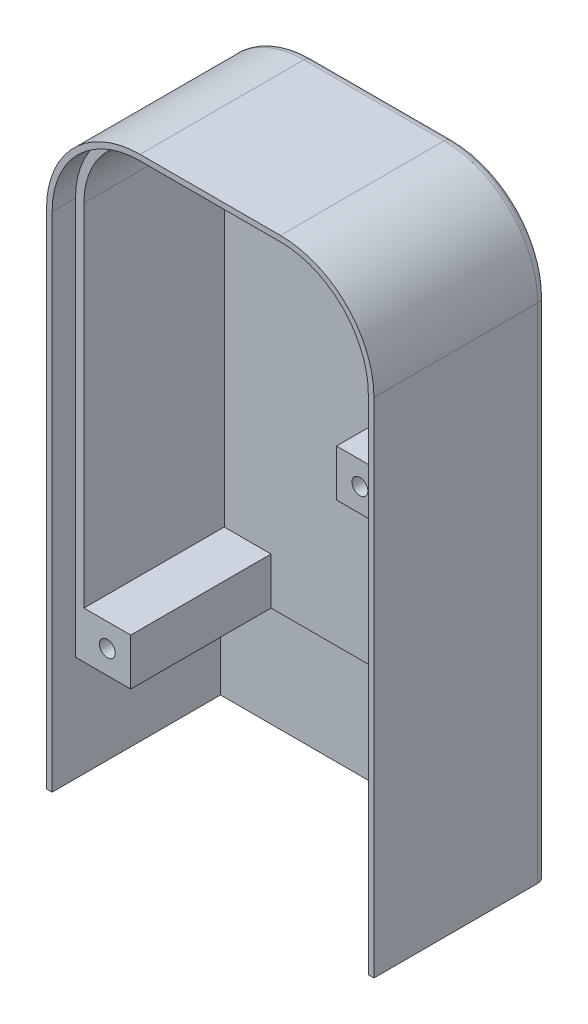
ISO-10303-21;
HEADER;
FILE_DESCRIPTION(('STEP AP214'),'2;1');
FILE_NAME('part.step','',(''),(''),'','','');
FILE_SCHEMA(('AUTOMOTIVE_DESIGN { 1 0 10303 214 1 1 1 1 }'));
ENDSEC;
DATA;
#1=APPLICATION_CONTEXT('core data for automotive mechanical design processes');
#2=APPLICATION_PROTOCOL_DEFINITION('international standard','automotive_design',2000,#1);
#3=PRODUCT_CONTEXT('',#1,'mechanical');
#4=PRODUCT('Part','Part','',(#3));
#5=PRODUCT_RELATED_PRODUCT_CATEGORY('part','',(#4));
#6=PRODUCT_DEFINITION_FORMATION('','',#4);
#7=PRODUCT_DEFINITION_CONTEXT('part definition',#1,'design');
#8=PRODUCT_DEFINITION('design','',#6,#7);
#9=PRODUCT_DEFINITION_SHAPE('','',#8);
#10=(LENGTH_UNIT() NAMED_UNIT(*) SI_UNIT(.MILLI.,.METRE.));
#11=(NAMED_UNIT(*) PLANE_ANGLE_UNIT() SI_UNIT($,.RADIAN.));
#12=(NAMED_UNIT(*) SI_UNIT($,.STERADIAN.) SOLID_ANGLE_UNIT());
#13=UNCERTAINTY_MEASURE_WITH_UNIT(LENGTH_MEASURE(1.E-05),#10,'distance_accuracy_value','');
#14=(GEOMETRIC_REPRESENTATION_CONTEXT(3) GLOBAL_UNCERTAINTY_ASSIGNED_CONTEXT((#13)) GLOBAL_UNIT_ASSIGNED_CONTEXT((#10,
#11,#12)) REPRESENTATION_CONTEXT('',''));
#15=CARTESIAN_POINT('',(0.,0.,0.));
#16=DIRECTION('',(0.,0.,1.));
#17=DIRECTION('',(1.,0.,0.));
#18=AXIS2_PLACEMENT_3D('',#15,#16,#17);
#19=CARTESIAN_POINT('',(0.,86.8176900029544,0.));
#20=DIRECTION('',(0.,1.,0.));
#21=DIRECTION('',(0.,0.,1.));
#22=AXIS2_PLACEMENT_3D('',#19,#20,#21);
#23=PLANE('',#22);
#24=CARTESIAN_POINT('',(187.366428173932,86.8176900029544,-35.));
#25=DIRECTION('',(0.,1.,0.));
#26=DIRECTION('',(0.,0.,1.));
#27=AXIS2_PLACEMENT_3D('',#24,#25,#26);
#28=CIRCLE('',#27,2.);
#29=CARTESIAN_POINT('',(187.366428173932,86.8176900029544,-37.));
#30=VERTEX_POINT('',#29);
#31=CARTESIAN_POINT('',(189.366428173932,86.8176900029544,-35.));
#32=VERTEX_POINT('',#31);
#33=EDGE_CURVE('E41',#30,#32,#28,.F.);
#34=ORIENTED_EDGE('',*,*,#33,.T.);
#35=DIRECTION('',(0.,0.,1.));
#36=VECTOR('',#35,1.);
#37=CARTESIAN_POINT('',(189.366428173932,86.8176900029544,-37.));
#38=LINE('',#37,#36);
#39=CARTESIAN_POINT('',(189.366428173932,86.8176900029544,0.));
#40=VERTEX_POINT('',#39);
#41=EDGE_CURVE('E467',#32,#40,#38,.T.);
#42=ORIENTED_EDGE('',*,*,#41,.T.);
#43=DIRECTION('',(-1.,0.,0.));
#44=VECTOR('',#43,1.);
#45=CARTESIAN_POINT('',(169.366428173932,86.8176900029544,0.));
#46=LINE('',#45,#44);
#47=CARTESIAN_POINT('',(188.166428173932,86.8176900029544,0.));
#48=VERTEX_POINT('',#47);
#49=EDGE_CURVE('E466',#40,#48,#46,.T.);
#50=ORIENTED_EDGE('',*,*,#49,.T.);
#51=DIRECTION('',(0.,0.,1.));
#52=VECTOR('',#51,1.);
#53=CARTESIAN_POINT('',(188.166428173932,86.8176900029544,-37.));
#54=LINE('',#53,#52);
#55=CARTESIAN_POINT('',(188.166428173932,86.8176900029544,-36.));
#56=VERTEX_POINT('',#55);
#57=EDGE_CURVE('E449',#56,#48,#54,.T.);
#58=ORIENTED_EDGE('',*,*,#57,.F.);
#59=DIRECTION('',(-1.,0.,0.));
#60=VECTOR('',#59,1.);
#61=CARTESIAN_POINT('',(120.566428173932,86.8176900029544,-36.));
#62=LINE('',#61,#60);
#63=CARTESIAN_POINT('',(120.566428173932,86.8176900029544,-36.));
#64=VERTEX_POINT('',#63);
#65=EDGE_CURVE('E11',#56,#64,#62,.T.);
#66=ORIENTED_EDGE('',*,*,#65,.T.);
#67=DIRECTION('',(0.,0.,-1.));
#68=VECTOR('',#67,1.);
#69=CARTESIAN_POINT('',(120.566428173932,86.8176900029544,-37.));
#70=LINE('',#69,#68);
#71=CARTESIAN_POINT('',(120.566428173932,86.8176900029544,0.));
#72=VERTEX_POINT('',#71);
#73=EDGE_CURVE('E49',#72,#64,#70,.T.);
#74=ORIENTED_EDGE('',*,*,#73,.F.);
#75=CARTESIAN_POINT('',(119.366428173932,86.8176900029544,0.));
#76=VERTEX_POINT('',#75);
#77=EDGE_CURVE('E462',#72,#76,#46,.T.);
#78=ORIENTED_EDGE('',*,*,#77,.T.);
#79=DIRECTION('',(0.,0.,-1.));
#80=VECTOR('',#79,1.);
#81=CARTESIAN_POINT('',(119.366428173932,86.8176900029544,-37.));
#82=LINE('',#81,#80);
#83=CARTESIAN_POINT('',(119.366428173932,86.8176900029544,-35.));
#84=VERTEX_POINT('',#83);
#85=EDGE_CURVE('E470',#76,#84,#82,.T.);
#86=ORIENTED_EDGE('',*,*,#85,.T.);
#87=CARTESIAN_POINT('',(121.366428173932,86.8176900029544,-35.));
#88=DIRECTION('',(0.,1.,0.));
#89=DIRECTION('',(0.,0.,1.));
#90=AXIS2_PLACEMENT_3D('',#87,#88,#89);
#91=CIRCLE('',#90,2.);
#92=CARTESIAN_POINT('',(121.366428173932,86.8176900029544,-37.));
#93=VERTEX_POINT('',#92);
#94=EDGE_CURVE('E465',#84,#93,#91,.F.);
#95=ORIENTED_EDGE('',*,*,#94,.T.);
#96=DIRECTION('',(-1.,0.,0.));
#97=VECTOR('',#96,1.);
#98=CARTESIAN_POINT('',(169.366428173932,86.8176900029544,-37.));
#99=LINE('',#98,#97);
#100=EDGE_CURVE('E36',#30,#93,#99,.T.);
#101=ORIENTED_EDGE('',*,*,#100,.F.);
#102=EDGE_LOOP('',(#34,#42,#50,#58,#66,#74,#78,#86,#95,#101));
#103=FACE_BOUND('',#102,.T.);
#104=ADVANCED_FACE('F33',(#103),#23,.F.);
#105=CARTESIAN_POINT('',(181.366428173932,171.317690002954,-25.));
#106=DIRECTION('',(0.,0.,-1.));
#107=DIRECTION('',(-1.,0.,0.));
#108=AXIS2_PLACEMENT_3D('',#105,#106,#107);
#109=PLANE('',#108);
#110=CARTESIAN_POINT('',(181.366428173932,171.317690002954,-25.));
#111=DIRECTION('',(0.,0.,-1.));
#112=DIRECTION('',(-1.,0.,0.));
#113=AXIS2_PLACEMENT_3D('',#110,#111,#112);
#114=CIRCLE('',#113,2.99999999999999);
#115=CARTESIAN_POINT('',(178.366428173932,171.317690002954,-25.));
#116=VERTEX_POINT('',#115);
#117=EDGE_CURVE('E263',#116,#116,#114,.T.);
#118=ORIENTED_EDGE('',*,*,#117,.T.);
#119=EDGE_LOOP('',(#118));
#120=FACE_BOUND('',#119,.T.);
#121=CARTESIAN_POINT('',(181.366428173932,171.317690002954,-25.));
#122=DIRECTION('',(0.,0.,-1.));
#123=DIRECTION('',(-1.,0.,0.));
#124=AXIS2_PLACEMENT_3D('',#121,#122,#123);
#125=CIRCLE('',#124,1.69999999999998);
#126=CARTESIAN_POINT('',(179.666428173932,171.317690002954,-25.));
#127=VERTEX_POINT('',#126);
#128=EDGE_CURVE('E266',#127,#127,#125,.F.);
#129=ORIENTED_EDGE('',*,*,#128,.T.);
#130=EDGE_LOOP('',(#129));
#131=FACE_BOUND('',#130,.T.);
#132=ADVANCED_FACE('F599',(#120,#131),#109,.T.);
#133=CARTESIAN_POINT('',(127.366428173932,114.317690002954,-25.));
#134=DIRECTION('',(0.,0.,-1.));
#135=DIRECTION('',(-1.,0.,0.));
#136=AXIS2_PLACEMENT_3D('',#133,#134,#135);
#137=PLANE('',#136);
#138=CARTESIAN_POINT('',(127.366428173932,114.317690002954,-25.));
#139=DIRECTION('',(0.,0.,-1.));
#140=DIRECTION('',(-1.,0.,0.));
#141=AXIS2_PLACEMENT_3D('',#138,#139,#140);
#142=CIRCLE('',#141,3.00000000000001);
#143=CARTESIAN_POINT('',(124.366428173932,114.317690002954,-25.));
#144=VERTEX_POINT('',#143);
#145=EDGE_CURVE('E255',#144,#144,#142,.T.);
#146=ORIENTED_EDGE('',*,*,#145,.T.);
#147=EDGE_LOOP('',(#146));
#148=FACE_BOUND('',#147,.T.);
#149=CARTESIAN_POINT('',(127.366428173932,114.317690002954,-25.));
#150=DIRECTION('',(0.,0.,-1.));
#151=DIRECTION('',(-1.,0.,0.));
#152=AXIS2_PLACEMENT_3D('',#149,#150,#151);
#153=CIRCLE('',#152,1.69999999999998);
#154=CARTESIAN_POINT('',(125.666428173932,114.317690002954,-25.));
#155=VERTEX_POINT('',#154);
#156=EDGE_CURVE('E258',#155,#155,#153,.F.);
#157=ORIENTED_EDGE('',*,*,#156,.T.);
#158=EDGE_LOOP('',(#157));
#159=FACE_BOUND('',#158,.T.);
#160=ADVANCED_FACE('F603',(#148,#159),#137,.T.);
#161=CARTESIAN_POINT('',(127.366428173932,114.317690002954,-4.50000000000011));
#162=DIRECTION('',(0.,0.,1.));
#163=DIRECTION('',(1.,0.,0.));
#164=AXIS2_PLACEMENT_3D('',#161,#162,#163);
#165=CYLINDRICAL_SURFACE('',#164,1.69999999999998);
#166=CARTESIAN_POINT('',(127.366428173932,114.317690002954,-5.));
#167=DIRECTION('',(0.,0.,1.));
#168=DIRECTION('',(1.,0.,0.));
#169=AXIS2_PLACEMENT_3D('',#166,#167,#168);
#170=CIRCLE('',#169,1.69999999999998);
#171=CARTESIAN_POINT('',(129.066428173932,114.317690002954,-5.));
#172=VERTEX_POINT('',#171);
#173=EDGE_CURVE('E421',#172,#172,#170,.T.);
#174=ORIENTED_EDGE('',*,*,#173,.T.);
#175=EDGE_LOOP('',(#174));
#176=FACE_BOUND('',#175,.T.);
#177=ORIENTED_EDGE('',*,*,#156,.F.);
#178=EDGE_LOOP('',(#177));
#179=FACE_BOUND('',#178,.T.);
#180=ADVANCED_FACE('F615',(#176,#179),#165,.F.);
#181=CARTESIAN_POINT('',(181.366428173932,171.317690002954,-4.50000000000011));
#182=DIRECTION('',(0.,0.,1.));
#183=DIRECTION('',(1.,0.,0.));
#184=AXIS2_PLACEMENT_3D('',#181,#182,#183);
#185=CYLINDRICAL_SURFACE('',#184,1.69999999999998);
#186=CARTESIAN_POINT('',(181.366428173932,171.317690002954,-5.));
#187=DIRECTION('',(0.,0.,1.));
#188=DIRECTION('',(1.,0.,0.));
#189=AXIS2_PLACEMENT_3D('',#186,#187,#188);
#190=CIRCLE('',#189,1.69999999999998);
#191=CARTESIAN_POINT('',(183.066428173932,171.317690002954,-5.));
#192=VERTEX_POINT('',#191);
#193=EDGE_CURVE('E297',#192,#192,#190,.T.);
#194=ORIENTED_EDGE('',*,*,#193,.T.);
#195=EDGE_LOOP('',(#194));
#196=FACE_BOUND('',#195,.T.);
#197=ORIENTED_EDGE('',*,*,#128,.F.);
#198=EDGE_LOOP('',(#197));
#199=FACE_BOUND('',#198,.T.);
#200=ADVANCED_FACE('F627',(#196,#199),#185,.F.);
#201=CARTESIAN_POINT('',(186.366428173932,166.317690002954,9.14213562373104));
#202=DIRECTION('',(0.,1.,0.));
#203=DIRECTION('',(0.,0.,1.));
#204=AXIS2_PLACEMENT_3D('',#201,#202,#203);
#205=PLANE('',#204);
#206=DIRECTION('',(1.,0.,0.));
#207=VECTOR('',#206,1.);
#208=CARTESIAN_POINT('',(186.366428173932,166.317690002954,-5.));
#209=LINE('',#208,#207);
#210=CARTESIAN_POINT('',(176.366428173932,166.317690002954,-5.));
#211=VERTEX_POINT('',#210);
#212=CARTESIAN_POINT('',(186.366428173932,166.317690002954,-5.));
#213=VERTEX_POINT('',#212);
#214=EDGE_CURVE('E284',#211,#213,#209,.T.);
#215=ORIENTED_EDGE('',*,*,#214,.F.);
#216=DIRECTION('',(0.,0.,-1.));
#217=VECTOR('',#216,1.);
#218=CARTESIAN_POINT('',(176.366428173932,166.317690002954,9.14213562373104));
#219=LINE('',#218,#217);
#220=CARTESIAN_POINT('',(176.366428173932,166.317690002954,-35.));
#221=VERTEX_POINT('',#220);
#222=EDGE_CURVE('E279',#211,#221,#219,.T.);
#223=ORIENTED_EDGE('',*,*,#222,.T.);
#224=DIRECTION('',(1.,0.,0.));
#225=VECTOR('',#224,1.);
#226=CARTESIAN_POINT('',(186.366428173932,166.317690002954,-35.));
#227=LINE('',#226,#225);
#228=CARTESIAN_POINT('',(186.366428173932,166.317690002954,-35.));
#229=VERTEX_POINT('',#228);
#230=EDGE_CURVE('E275',#221,#229,#227,.T.);
#231=ORIENTED_EDGE('',*,*,#230,.T.);
#232=DIRECTION('',(0.,0.,-1.));
#233=VECTOR('',#232,1.);
#234=CARTESIAN_POINT('',(186.366428173932,166.317690002954,9.14213562373104));
#235=LINE('',#234,#233);
#236=EDGE_CURVE('E278',#213,#229,#235,.T.);
#237=ORIENTED_EDGE('',*,*,#236,.F.);
#238=EDGE_LOOP('',(#215,#223,#231,#237));
#239=FACE_BOUND('',#238,.T.);
#240=ADVANCED_FACE('F535',(#239),#205,.F.);
#241=CARTESIAN_POINT('',(176.366428173932,166.317690002954,9.14213562373104));
#242=DIRECTION('',(1.,0.,0.));
#243=DIRECTION('',(0.,1.,0.));
#244=AXIS2_PLACEMENT_3D('',#241,#242,#243);
#245=PLANE('',#244);
#246=DIRECTION('',(0.,-1.,0.));
#247=VECTOR('',#246,1.);
#248=CARTESIAN_POINT('',(176.366428173932,166.317690002954,-5.));
#249=LINE('',#248,#247);
#250=CARTESIAN_POINT('',(176.366428173932,176.317690002954,-5.));
#251=VERTEX_POINT('',#250);
#252=EDGE_CURVE('E287',#251,#211,#249,.T.);
#253=ORIENTED_EDGE('',*,*,#252,.F.);
#254=DIRECTION('',(0.,0.,-1.));
#255=VECTOR('',#254,1.);
#256=CARTESIAN_POINT('',(176.366428173932,176.317690002954,9.14213562373104));
#257=LINE('',#256,#255);
#258=CARTESIAN_POINT('',(176.366428173932,176.317690002954,-35.));
#259=VERTEX_POINT('',#258);
#260=EDGE_CURVE('E283',#251,#259,#257,.T.);
#261=ORIENTED_EDGE('',*,*,#260,.T.);
#262=DIRECTION('',(0.,-1.,0.));
#263=VECTOR('',#262,1.);
#264=CARTESIAN_POINT('',(176.366428173932,166.317690002954,-35.));
#265=LINE('',#264,#263);
#266=EDGE_CURVE('E280',#259,#221,#265,.T.);
#267=ORIENTED_EDGE('',*,*,#266,.T.);
#268=ORIENTED_EDGE('',*,*,#222,.F.);
#269=EDGE_LOOP('',(#253,#261,#267,#268));
#270=FACE_BOUND('',#269,.T.);
#271=ADVANCED_FACE('F539',(#270),#245,.F.);
#272=CARTESIAN_POINT('',(176.366428173932,176.317690002954,9.14213562373104));
#273=DIRECTION('',(0.,-1.,0.));
#274=DIRECTION('',(0.,0.,-1.));
#275=AXIS2_PLACEMENT_3D('',#272,#273,#274);
#276=PLANE('',#275);
#277=DIRECTION('',(-1.,0.,0.));
#278=VECTOR('',#277,1.);
#279=CARTESIAN_POINT('',(176.366428173932,176.317690002954,-5.));
#280=LINE('',#279,#278);
#281=CARTESIAN_POINT('',(186.366428173932,176.317690002954,-5.));
#282=VERTEX_POINT('',#281);
#283=EDGE_CURVE('E273',#282,#251,#280,.T.);
#284=ORIENTED_EDGE('',*,*,#283,.F.);
#285=DIRECTION('',(0.,0.,-1.));
#286=VECTOR('',#285,1.);
#287=CARTESIAN_POINT('',(186.366428173932,176.317690002954,9.14213562373104));
#288=LINE('',#287,#286);
#289=CARTESIAN_POINT('',(186.366428173932,176.317690002954,-35.));
#290=VERTEX_POINT('',#289);
#291=EDGE_CURVE('E274',#282,#290,#288,.T.);
#292=ORIENTED_EDGE('',*,*,#291,.T.);
#293=DIRECTION('',(-1.,0.,0.));
#294=VECTOR('',#293,1.);
#295=CARTESIAN_POINT('',(176.366428173932,176.317690002954,-35.));
#296=LINE('',#295,#294);
#297=EDGE_CURVE('E270',#290,#259,#296,.T.);
#298=ORIENTED_EDGE('',*,*,#297,.T.);
#299=ORIENTED_EDGE('',*,*,#260,.F.);
#300=EDGE_LOOP('',(#284,#292,#298,#299));
#301=FACE_BOUND('',#300,.T.);
#302=ADVANCED_FACE('F632',(#301),#276,.F.);
#303=CARTESIAN_POINT('',(186.366428173932,194.317690002954,-37.));
#304=DIRECTION('',(1.,0.,0.));
#305=DIRECTION('',(0.,0.,-1.));
#306=AXIS2_PLACEMENT_3D('',#303,#304,#305);
#307=PLANE('',#306);
#308=ORIENTED_EDGE('',*,*,#291,.F.);
#309=DIRECTION('',(0.,-1.,0.));
#310=VECTOR('',#309,1.);
#311=CARTESIAN_POINT('',(186.366428173932,194.317690002954,-5.));
#312=LINE('',#311,#310);
#313=CARTESIAN_POINT('',(186.366428173932,194.317690002954,-5.));
#314=VERTEX_POINT('',#313);
#315=EDGE_CURVE('E346',#314,#282,#312,.T.);
#316=ORIENTED_EDGE('',*,*,#315,.F.);
#317=DIRECTION('',(0.,0.,-1.));
#318=VECTOR('',#317,1.);
#319=CARTESIAN_POINT('',(186.366428173932,194.317690002954,-37.));
#320=LINE('',#319,#318);
#321=CARTESIAN_POINT('',(186.366428173932,194.317690002954,-35.));
#322=VERTEX_POINT('',#321);
#323=EDGE_CURVE('E327',#322,#314,#320,.F.);
#324=ORIENTED_EDGE('',*,*,#323,.F.);
#325=DIRECTION('',(0.,1.,0.));
#326=VECTOR('',#325,1.);
#327=CARTESIAN_POINT('',(186.366428173932,-25.6823099970456,-35.));
#328=LINE('',#327,#326);
#329=EDGE_CURVE('E309',#290,#322,#328,.T.);
#330=ORIENTED_EDGE('',*,*,#329,.F.);
#331=EDGE_LOOP('',(#308,#316,#324,#330));
#332=FACE_BOUND('',#331,.T.);
#333=ADVANCED_FACE('F546',(#332),#307,.F.);
#334=CARTESIAN_POINT('',(169.366428173932,194.317690002954,-37.));
#335=DIRECTION('',(0.,0.,1.));
#336=DIRECTION('',(1.,0.,0.));
#337=AXIS2_PLACEMENT_3D('',#334,#335,#336);
#338=CYLINDRICAL_SURFACE('',#337,17.);
#339=DIRECTION('',(0.,0.,1.));
#340=VECTOR('',#339,1.);
#341=CARTESIAN_POINT('',(169.366428173932,211.317690002954,-37.));
#342=LINE('',#341,#340);
#343=CARTESIAN_POINT('',(169.366428173932,211.317690002954,-35.));
#344=VERTEX_POINT('',#343);
#345=CARTESIAN_POINT('',(169.366428173932,211.317690002954,-5.));
#346=VERTEX_POINT('',#345);
#347=EDGE_CURVE('E331',#344,#346,#342,.T.);
#348=ORIENTED_EDGE('',*,*,#347,.F.);
#349=CARTESIAN_POINT('',(169.366428173932,194.317690002954,-35.));
#350=DIRECTION('',(0.,0.,1.));
#351=DIRECTION('',(1.,0.,0.));
#352=AXIS2_PLACEMENT_3D('',#349,#350,#351);
#353=CIRCLE('',#352,17.);
#354=EDGE_CURVE('E339',#322,#344,#353,.T.);
#355=ORIENTED_EDGE('',*,*,#354,.F.);
#356=ORIENTED_EDGE('',*,*,#323,.T.);
#357=CARTESIAN_POINT('',(169.366428173932,194.317690002954,-5.));
#358=DIRECTION('',(0.,0.,1.));
#359=DIRECTION('',(1.,0.,0.));
#360=AXIS2_PLACEMENT_3D('',#357,#358,#359);
#361=CIRCLE('',#360,17.);
#362=EDGE_CURVE('E349',#346,#314,#361,.F.);
#363=ORIENTED_EDGE('',*,*,#362,.F.);
#364=EDGE_LOOP('',(#348,#355,#356,#363));
#365=FACE_BOUND('',#364,.T.);
#366=ADVANCED_FACE('F549',(#365),#338,.F.);
#367=CARTESIAN_POINT('',(139.366428173932,211.317690002954,-37.));
#368=DIRECTION('',(0.,1.,0.));
#369=DIRECTION('',(0.,0.,1.));
#370=AXIS2_PLACEMENT_3D('',#367,#368,#369);
#371=PLANE('',#370);
#372=DIRECTION('',(0.,0.,1.));
#373=VECTOR('',#372,1.);
#374=CARTESIAN_POINT('',(139.366428173932,211.317690002954,-37.));
#375=LINE('',#374,#373);
#376=CARTESIAN_POINT('',(139.366428173932,211.317690002954,-35.));
#377=VERTEX_POINT('',#376);
#378=CARTESIAN_POINT('',(139.366428173932,211.317690002954,-5.));
#379=VERTEX_POINT('',#378);
#380=EDGE_CURVE('E323',#377,#379,#375,.T.);
#381=ORIENTED_EDGE('',*,*,#380,.F.);
#382=DIRECTION('',(-1.,0.,0.));
#383=VECTOR('',#382,1.);
#384=CARTESIAN_POINT('',(169.366428173932,211.317690002954,-35.));
#385=LINE('',#384,#383);
#386=EDGE_CURVE('E334',#344,#377,#385,.T.);
#387=ORIENTED_EDGE('',*,*,#386,.F.);
#388=ORIENTED_EDGE('',*,*,#347,.T.);
#389=DIRECTION('',(1.,0.,0.));
#390=VECTOR('',#389,1.);
#391=CARTESIAN_POINT('',(139.366428173932,211.317690002954,-5.));
#392=LINE('',#391,#390);
#393=EDGE_CURVE('E352',#379,#346,#392,.T.);
#394=ORIENTED_EDGE('',*,*,#393,.F.);
#395=EDGE_LOOP('',(#381,#387,#388,#394));
#396=FACE_BOUND('',#395,.T.);
#397=ADVANCED_FACE('F553',(#396),#371,.F.);
#398=CARTESIAN_POINT('',(139.366428173932,194.317690002954,-37.));
#399=DIRECTION('',(0.,0.,1.));
#400=DIRECTION('',(1.,0.,0.));
#401=AXIS2_PLACEMENT_3D('',#398,#399,#400);
#402=CYLINDRICAL_SURFACE('',#401,17.);
#403=DIRECTION('',(0.,0.,1.));
#404=VECTOR('',#403,1.);
#405=CARTESIAN_POINT('',(122.366428173932,194.317690002954,-37.));
#406=LINE('',#405,#404);
#407=CARTESIAN_POINT('',(122.366428173932,194.317690002954,-35.));
#408=VERTEX_POINT('',#407);
#409=CARTESIAN_POINT('',(122.366428173932,194.317690002954,-5.));
#410=VERTEX_POINT('',#409);
#411=EDGE_CURVE('E319',#408,#410,#406,.T.);
#412=ORIENTED_EDGE('',*,*,#411,.F.);
#413=CARTESIAN_POINT('',(139.366428173932,194.317690002954,-35.));
#414=DIRECTION('',(0.,0.,1.));
#415=DIRECTION('',(1.,0.,0.));
#416=AXIS2_PLACEMENT_3D('',#413,#414,#415);
#417=CIRCLE('',#416,17.);
#418=EDGE_CURVE('E328',#377,#408,#417,.T.);
#419=ORIENTED_EDGE('',*,*,#418,.F.);
#420=ORIENTED_EDGE('',*,*,#380,.T.);
#421=CARTESIAN_POINT('',(139.366428173932,194.317690002954,-5.));
#422=DIRECTION('',(0.,0.,1.));
#423=DIRECTION('',(1.,0.,0.));
#424=AXIS2_PLACEMENT_3D('',#421,#422,#423);
#425=CIRCLE('',#424,17.);
#426=EDGE_CURVE('E355',#410,#379,#425,.F.);
#427=ORIENTED_EDGE('',*,*,#426,.F.);
#428=EDGE_LOOP('',(#412,#419,#420,#427));
#429=FACE_BOUND('',#428,.T.);
#430=ADVANCED_FACE('F556',(#429),#402,.F.);
#431=CARTESIAN_POINT('',(122.366428173932,64.3176900029544,-37.));
#432=DIRECTION('',(-1.,0.,0.));
#433=DIRECTION('',(0.,-1.,0.));
#434=AXIS2_PLACEMENT_3D('',#431,#432,#433);
#435=PLANE('',#434);
#436=DIRECTION('',(0.,0.,-1.));
#437=VECTOR('',#436,1.);
#438=CARTESIAN_POINT('',(122.366428173932,119.317690002954,9.14213562373104));
#439=LINE('',#438,#437);
#440=CARTESIAN_POINT('',(122.366428173932,119.317690002954,-5.));
#441=VERTEX_POINT('',#440);
#442=CARTESIAN_POINT('',(122.366428173932,119.317690002954,-35.));
#443=VERTEX_POINT('',#442);
#444=EDGE_CURVE('E286',#441,#443,#439,.T.);
#445=ORIENTED_EDGE('',*,*,#444,.T.);
#446=DIRECTION('',(0.,-1.,0.));
#447=VECTOR('',#446,1.);
#448=CARTESIAN_POINT('',(122.366428173932,-25.6823099970456,-35.));
#449=LINE('',#448,#447);
#450=EDGE_CURVE('E324',#408,#443,#449,.T.);
#451=ORIENTED_EDGE('',*,*,#450,.F.);
#452=ORIENTED_EDGE('',*,*,#411,.T.);
#453=DIRECTION('',(0.,1.,0.));
#454=VECTOR('',#453,1.);
#455=CARTESIAN_POINT('',(122.366428173932,64.3176900029544,-5.));
#456=LINE('',#455,#454);
#457=EDGE_CURVE('E358',#441,#410,#456,.T.);
#458=ORIENTED_EDGE('',*,*,#457,.F.);
#459=EDGE_LOOP('',(#445,#451,#452,#458));
#460=FACE_BOUND('',#459,.T.);
#461=ADVANCED_FACE('F560',(#460),#435,.F.);
#462=CARTESIAN_POINT('',(122.366428173932,119.317690002954,9.14213562373104));
#463=DIRECTION('',(0.,-1.,0.));
#464=DIRECTION('',(0.,0.,-1.));
#465=AXIS2_PLACEMENT_3D('',#462,#463,#464);
#466=PLANE('',#465);
#467=DIRECTION('',(-1.,0.,0.));
#468=VECTOR('',#467,1.);
#469=CARTESIAN_POINT('',(122.366428173932,119.317690002954,-5.));
#470=LINE('',#469,#468);
#471=CARTESIAN_POINT('',(132.366428173932,119.317690002954,-5.));
#472=VERTEX_POINT('',#471);
#473=EDGE_CURVE('E300',#472,#441,#470,.T.);
#474=ORIENTED_EDGE('',*,*,#473,.F.);
#475=DIRECTION('',(0.,0.,-1.));
#476=VECTOR('',#475,1.);
#477=CARTESIAN_POINT('',(132.366428173932,119.317690002954,9.14213562373104));
#478=LINE('',#477,#476);
#479=CARTESIAN_POINT('',(132.366428173932,119.317690002954,-35.));
#480=VERTEX_POINT('',#479);
#481=EDGE_CURVE('E301',#472,#480,#478,.T.);
#482=ORIENTED_EDGE('',*,*,#481,.T.);
#483=DIRECTION('',(-1.,0.,0.));
#484=VECTOR('',#483,1.);
#485=CARTESIAN_POINT('',(122.366428173932,119.317690002954,-35.));
#486=LINE('',#485,#484);
#487=EDGE_CURVE('E298',#480,#443,#486,.T.);
#488=ORIENTED_EDGE('',*,*,#487,.T.);
#489=ORIENTED_EDGE('',*,*,#444,.F.);
#490=EDGE_LOOP('',(#474,#482,#488,#489));
#491=FACE_BOUND('',#490,.T.);
#492=ADVANCED_FACE('F565',(#491),#466,.F.);
#493=CARTESIAN_POINT('',(186.366428173932,109.317690002954,-35.));
#494=VERTEX_POINT('',#493);
#495=EDGE_CURVE('E344',#494,#229,#328,.T.);
#496=ORIENTED_EDGE('',*,*,#495,.F.);
#497=DIRECTION('',(0.,0.,1.));
#498=VECTOR('',#497,1.);
#499=CARTESIAN_POINT('',(186.366428173932,109.317690002954,-37.));
#500=LINE('',#499,#498);
#501=CARTESIAN_POINT('',(186.366428173932,109.317690002954,-5.));
#502=VERTEX_POINT('',#501);
#503=EDGE_CURVE('E243',#494,#502,#500,.T.);
#504=ORIENTED_EDGE('',*,*,#503,.T.);
#505=EDGE_CURVE('E322',#213,#502,#312,.T.);
#506=ORIENTED_EDGE('',*,*,#505,.F.);
#507=ORIENTED_EDGE('',*,*,#236,.T.);
#508=EDGE_LOOP('',(#496,#504,#506,#507));
#509=FACE_BOUND('',#508,.T.);
#510=ADVANCED_FACE('F527',(#509),#307,.F.);
#511=CARTESIAN_POINT('',(132.366428173932,119.317690002954,9.14213562373104));
#512=DIRECTION('',(-1.,0.,0.));
#513=DIRECTION('',(0.,0.,1.));
#514=AXIS2_PLACEMENT_3D('',#511,#512,#513);
#515=PLANE('',#514);
#516=DIRECTION('',(0.,1.,0.));
#517=VECTOR('',#516,1.);
#518=CARTESIAN_POINT('',(132.366428173932,119.317690002954,-5.));
#519=LINE('',#518,#517);
#520=CARTESIAN_POINT('',(132.366428173932,109.317690002954,-5.));
#521=VERTEX_POINT('',#520);
#522=EDGE_CURVE('E306',#521,#472,#519,.T.);
#523=ORIENTED_EDGE('',*,*,#522,.F.);
#524=DIRECTION('',(0.,0.,-1.));
#525=VECTOR('',#524,1.);
#526=CARTESIAN_POINT('',(132.366428173932,109.317690002954,9.14213562373104));
#527=LINE('',#526,#525);
#528=CARTESIAN_POINT('',(132.366428173932,109.317690002954,-35.));
#529=VERTEX_POINT('',#528);
#530=EDGE_CURVE('E305',#521,#529,#527,.T.);
#531=ORIENTED_EDGE('',*,*,#530,.T.);
#532=DIRECTION('',(0.,1.,0.));
#533=VECTOR('',#532,1.);
#534=CARTESIAN_POINT('',(132.366428173932,119.317690002954,-35.));
#535=LINE('',#534,#533);
#536=EDGE_CURVE('E302',#529,#480,#535,.T.);
#537=ORIENTED_EDGE('',*,*,#536,.T.);
#538=ORIENTED_EDGE('',*,*,#481,.F.);
#539=EDGE_LOOP('',(#523,#531,#537,#538));
#540=FACE_BOUND('',#539,.T.);
#541=ADVANCED_FACE('F567',(#540),#515,.F.);
#542=CARTESIAN_POINT('',(169.366428173932,-25.6823099970456,-35.));
#543=DIRECTION('',(0.,0.,1.));
#544=DIRECTION('',(1.,0.,0.));
#545=AXIS2_PLACEMENT_3D('',#542,#543,#544);
#546=PLANE('',#545);
#547=DIRECTION('',(-1.,0.,0.));
#548=VECTOR('',#547,1.);
#549=CARTESIAN_POINT('',(169.366428173932,109.317690002954,-35.));
#550=LINE('',#549,#548);
#551=EDGE_CURVE('E247',#494,#529,#550,.T.);
#552=ORIENTED_EDGE('',*,*,#551,.F.);
#553=ORIENTED_EDGE('',*,*,#495,.T.);
#554=ORIENTED_EDGE('',*,*,#230,.F.);
#555=ORIENTED_EDGE('',*,*,#266,.F.);
#556=ORIENTED_EDGE('',*,*,#297,.F.);
#557=ORIENTED_EDGE('',*,*,#329,.T.);
#558=ORIENTED_EDGE('',*,*,#354,.T.);
#559=ORIENTED_EDGE('',*,*,#386,.T.);
#560=ORIENTED_EDGE('',*,*,#418,.T.);
#561=ORIENTED_EDGE('',*,*,#450,.T.);
#562=ORIENTED_EDGE('',*,*,#487,.F.);
#563=ORIENTED_EDGE('',*,*,#536,.F.);
#564=EDGE_LOOP('',(#552,#553,#554,#555,#556,#557,#558,#559,#560,#561,#562,#563));
#565=FACE_BOUND('',#564,.T.);
#566=ADVANCED_FACE('F531',(#565),#546,.T.);
#567=CARTESIAN_POINT('',(181.366428173932,171.317690002954,-25.));
#568=DIRECTION('',(0.,0.,-1.));
#569=DIRECTION('',(-1.,0.,0.));
#570=AXIS2_PLACEMENT_3D('',#567,#568,#569);
#571=CYLINDRICAL_SURFACE('',#570,2.99999999999999);
#572=ORIENTED_EDGE('',*,*,#117,.F.);
#573=EDGE_LOOP('',(#572));
#574=FACE_BOUND('',#573,.T.);
#575=CARTESIAN_POINT('',(181.366428173932,171.317690002954,-37.));
#576=DIRECTION('',(0.,0.,-1.));
#577=DIRECTION('',(-1.,0.,0.));
#578=AXIS2_PLACEMENT_3D('',#575,#576,#577);
#579=CIRCLE('',#578,2.99999999999999);
#580=CARTESIAN_POINT('',(178.366428173932,171.317690002954,-37.));
#581=VERTEX_POINT('',#580);
#582=EDGE_CURVE('E267',#581,#581,#579,.T.);
#583=ORIENTED_EDGE('',*,*,#582,.T.);
#584=EDGE_LOOP('',(#583));
#585=FACE_BOUND('',#584,.T.);
#586=ADVANCED_FACE('F619',(#574,#585),#571,.F.);
#587=CARTESIAN_POINT('',(127.366428173932,114.317690002954,-25.));
#588=DIRECTION('',(0.,0.,-1.));
#589=DIRECTION('',(-1.,0.,0.));
#590=AXIS2_PLACEMENT_3D('',#587,#588,#589);
#591=CYLINDRICAL_SURFACE('',#590,3.00000000000001);
#592=ORIENTED_EDGE('',*,*,#145,.F.);
#593=EDGE_LOOP('',(#592));
#594=FACE_BOUND('',#593,.T.);
#595=CARTESIAN_POINT('',(127.366428173932,114.317690002954,-37.));
#596=DIRECTION('',(0.,0.,-1.));
#597=DIRECTION('',(-1.,0.,0.));
#598=AXIS2_PLACEMENT_3D('',#595,#596,#597);
#599=CIRCLE('',#598,3.00000000000001);
#600=CARTESIAN_POINT('',(124.366428173932,114.317690002954,-37.));
#601=VERTEX_POINT('',#600);
#602=EDGE_CURVE('E259',#601,#601,#599,.T.);
#603=ORIENTED_EDGE('',*,*,#602,.T.);
#604=EDGE_LOOP('',(#603));
#605=FACE_BOUND('',#604,.T.);
#606=ADVANCED_FACE('F617',(#594,#605),#591,.F.);
#607=CARTESIAN_POINT('',(139.366428173932,212.317690002954,-35.));
#608=DIRECTION('',(1.,0.,0.));
#609=DIRECTION('',(0.,0.,-1.));
#610=AXIS2_PLACEMENT_3D('',#607,#608,#609);
#611=CYLINDRICAL_SURFACE('',#610,2.);
#612=CARTESIAN_POINT('',(139.366428173932,212.317690002954,-35.));
#613=DIRECTION('',(1.,0.,0.));
#614=DIRECTION('',(0.,0.,-1.));
#615=AXIS2_PLACEMENT_3D('',#612,#613,#614);
#616=CIRCLE('',#615,2.);
#617=CARTESIAN_POINT('',(139.366428173932,212.317690002954,-37.));
#618=VERTEX_POINT('',#617);
#619=CARTESIAN_POINT('',(139.366428173932,214.317690002954,-35.));
#620=VERTEX_POINT('',#619);
#621=EDGE_CURVE('E455',#618,#620,#616,.T.);
#622=ORIENTED_EDGE('',*,*,#621,.T.);
#623=DIRECTION('',(-1.,0.,0.));
#624=VECTOR('',#623,1.);
#625=CARTESIAN_POINT('',(139.366428173932,214.317690002954,-35.));
#626=LINE('',#625,#624);
#627=CARTESIAN_POINT('',(169.366428173932,214.317690002954,-35.));
#628=VERTEX_POINT('',#627);
#629=EDGE_CURVE('E443',#628,#620,#626,.T.);
#630=ORIENTED_EDGE('',*,*,#629,.F.);
#631=CARTESIAN_POINT('',(169.366428173932,212.317690002954,-35.));
#632=DIRECTION('',(1.,0.,0.));
#633=DIRECTION('',(0.,0.,-1.));
#634=AXIS2_PLACEMENT_3D('',#631,#632,#633);
#635=CIRCLE('',#634,2.);
#636=CARTESIAN_POINT('',(169.366428173932,212.317690002954,-37.));
#637=VERTEX_POINT('',#636);
#638=EDGE_CURVE('E452',#637,#628,#635,.T.);
#639=ORIENTED_EDGE('',*,*,#638,.F.);
#640=DIRECTION('',(-1.,0.,0.));
#641=VECTOR('',#640,1.);
#642=CARTESIAN_POINT('',(169.366428173932,212.317690002954,-37.));
#643=LINE('',#642,#641);
#644=EDGE_CURVE('E432',#618,#637,#643,.F.);
#645=ORIENTED_EDGE('',*,*,#644,.F.);
#646=EDGE_LOOP('',(#622,#630,#639,#645));
#647=FACE_BOUND('',#646,.T.);
#648=ADVANCED_FACE('F494',(#647),#611,.T.);
#649=CARTESIAN_POINT('',(139.366428173932,213.117690002954,-37.));
#650=DIRECTION('',(0.,1.,0.));
#651=DIRECTION('',(0.,0.,1.));
#652=AXIS2_PLACEMENT_3D('',#649,#650,#651);
#653=PLANE('',#652);
#654=DIRECTION('',(-1.,0.,0.));
#655=VECTOR('',#654,1.);
#656=CARTESIAN_POINT('',(169.366428173932,213.117690002954,0.));
#657=LINE('',#656,#655);
#658=CARTESIAN_POINT('',(169.366428173932,213.117690002954,0.));
#659=VERTEX_POINT('',#658);
#660=CARTESIAN_POINT('',(139.366428173932,213.117690002954,0.));
#661=VERTEX_POINT('',#660);
#662=EDGE_CURVE('E389',#659,#661,#657,.T.);
#663=ORIENTED_EDGE('',*,*,#662,.T.);
#664=DIRECTION('',(0.,0.,1.));
#665=VECTOR('',#664,1.);
#666=CARTESIAN_POINT('',(139.366428173932,213.117690002954,-37.));
#667=LINE('',#666,#665);
#668=CARTESIAN_POINT('',(139.366428173932,213.117690002954,-5.));
#669=VERTEX_POINT('',#668);
#670=EDGE_CURVE('E364',#669,#661,#667,.T.);
#671=ORIENTED_EDGE('',*,*,#670,.F.);
#672=DIRECTION('',(-1.,0.,0.));
#673=VECTOR('',#672,1.);
#674=CARTESIAN_POINT('',(169.366428173932,213.117690002954,-5.));
#675=LINE('',#674,#673);
#676=CARTESIAN_POINT('',(169.366428173932,213.117690002954,-5.));
#677=VERTEX_POINT('',#676);
#678=EDGE_CURVE('E374',#677,#669,#675,.T.);
#679=ORIENTED_EDGE('',*,*,#678,.F.);
#680=DIRECTION('',(0.,0.,1.));
#681=VECTOR('',#680,1.);
#682=CARTESIAN_POINT('',(169.366428173932,213.117690002954,-37.));
#683=LINE('',#682,#681);
#684=EDGE_CURVE('E371',#677,#659,#683,.T.);
#685=ORIENTED_EDGE('',*,*,#684,.T.);
#686=EDGE_LOOP('',(#663,#671,#679,#685));
#687=FACE_BOUND('',#686,.T.);
#688=ADVANCED_FACE('F661',(#687),#653,.F.);
#689=CARTESIAN_POINT('',(139.366428173932,194.317690002954,-37.));
#690=DIRECTION('',(0.,0.,1.));
#691=DIRECTION('',(1.,0.,0.));
#692=AXIS2_PLACEMENT_3D('',#689,#690,#691);
#693=CYLINDRICAL_SURFACE('',#692,20.);
#694=DIRECTION('',(0.,0.,1.));
#695=VECTOR('',#694,1.);
#696=CARTESIAN_POINT('',(139.366428173932,214.317690002954,-37.));
#697=LINE('',#696,#695);
#698=CARTESIAN_POINT('',(139.366428173932,214.317690002954,0.));
#699=VERTEX_POINT('',#698);
#700=EDGE_CURVE('E413',#620,#699,#697,.T.);
#701=ORIENTED_EDGE('',*,*,#700,.F.);
#702=CARTESIAN_POINT('',(139.366428173932,194.317690002954,-35.));
#703=DIRECTION('',(0.,0.,1.));
#704=DIRECTION('',(1.,0.,0.));
#705=AXIS2_PLACEMENT_3D('',#702,#703,#704);
#706=CIRCLE('',#705,20.);
#707=CARTESIAN_POINT('',(119.366428173932,194.317690002954,-35.));
#708=VERTEX_POINT('',#707);
#709=EDGE_CURVE('E441',#620,#708,#706,.T.);
#710=ORIENTED_EDGE('',*,*,#709,.T.);
#711=DIRECTION('',(0.,0.,1.));
#712=VECTOR('',#711,1.);
#713=CARTESIAN_POINT('',(119.366428173932,194.317690002954,-37.));
#714=LINE('',#713,#712);
#715=CARTESIAN_POINT('',(119.366428173932,194.317690002954,0.));
#716=VERTEX_POINT('',#715);
#717=EDGE_CURVE('E410',#708,#716,#714,.T.);
#718=ORIENTED_EDGE('',*,*,#717,.T.);
#719=CARTESIAN_POINT('',(139.366428173932,194.317690002954,0.));
#720=DIRECTION('',(0.,0.,1.));
#721=DIRECTION('',(1.,0.,0.));
#722=AXIS2_PLACEMENT_3D('',#719,#720,#721);
#723=CIRCLE('',#722,20.);
#724=EDGE_CURVE('E403',#699,#716,#723,.T.);
#725=ORIENTED_EDGE('',*,*,#724,.F.);
#726=EDGE_LOOP('',(#701,#710,#718,#725));
#727=FACE_BOUND('',#726,.T.);
#728=ADVANCED_FACE('F583',(#727),#693,.T.);
#729=CARTESIAN_POINT('',(139.366428173932,214.317690002954,-37.));
#730=DIRECTION('',(0.,1.,0.));
#731=DIRECTION('',(0.,0.,1.));
#732=AXIS2_PLACEMENT_3D('',#729,#730,#731);
#733=PLANE('',#732);
#734=DIRECTION('',(0.,0.,1.));
#735=VECTOR('',#734,1.);
#736=CARTESIAN_POINT('',(169.366428173932,214.317690002954,-37.));
#737=LINE('',#736,#735);
#738=CARTESIAN_POINT('',(169.366428173932,214.317690002954,0.));
#739=VERTEX_POINT('',#738);
#740=EDGE_CURVE('E415',#628,#739,#737,.T.);
#741=ORIENTED_EDGE('',*,*,#740,.F.);
#742=ORIENTED_EDGE('',*,*,#629,.T.);
#743=ORIENTED_EDGE('',*,*,#700,.T.);
#744=DIRECTION('',(-1.,0.,0.));
#745=VECTOR('',#744,1.);
#746=CARTESIAN_POINT('',(139.366428173932,214.317690002954,0.));
#747=LINE('',#746,#745);
#748=EDGE_CURVE('E400',#739,#699,#747,.T.);
#749=ORIENTED_EDGE('',*,*,#748,.F.);
#750=EDGE_LOOP('',(#741,#742,#743,#749));
#751=FACE_BOUND('',#750,.T.);
#752=ADVANCED_FACE('F587',(#751),#733,.T.);
#753=CARTESIAN_POINT('',(169.366428173932,194.317690002954,-37.));
#754=DIRECTION('',(0.,0.,1.));
#755=DIRECTION('',(1.,0.,0.));
#756=AXIS2_PLACEMENT_3D('',#753,#754,#755);
#757=CYLINDRICAL_SURFACE('',#756,20.);
#758=DIRECTION('',(0.,0.,1.));
#759=VECTOR('',#758,1.);
#760=CARTESIAN_POINT('',(189.366428173932,194.317690002954,-37.));
#761=LINE('',#760,#759);
#762=CARTESIAN_POINT('',(189.366428173932,194.317690002954,-35.));
#763=VERTEX_POINT('',#762);
#764=CARTESIAN_POINT('',(189.366428173932,194.317690002954,0.));
#765=VERTEX_POINT('',#764);
#766=EDGE_CURVE('E409',#763,#765,#761,.T.);
#767=ORIENTED_EDGE('',*,*,#766,.F.);
#768=CARTESIAN_POINT('',(169.366428173932,194.317690002954,-35.));
#769=DIRECTION('',(0.,0.,1.));
#770=DIRECTION('',(1.,0.,0.));
#771=AXIS2_PLACEMENT_3D('',#768,#769,#770);
#772=CIRCLE('',#771,20.);
#773=EDGE_CURVE('E445',#763,#628,#772,.T.);
#774=ORIENTED_EDGE('',*,*,#773,.T.);
#775=ORIENTED_EDGE('',*,*,#740,.T.);
#776=CARTESIAN_POINT('',(169.366428173932,194.317690002954,0.));
#777=DIRECTION('',(0.,0.,1.));
#778=DIRECTION('',(1.,0.,0.));
#779=AXIS2_PLACEMENT_3D('',#776,#777,#778);
#780=CIRCLE('',#779,20.);
#781=EDGE_CURVE('E397',#765,#739,#780,.T.);
#782=ORIENTED_EDGE('',*,*,#781,.F.);
#783=EDGE_LOOP('',(#767,#774,#775,#782));
#784=FACE_BOUND('',#783,.T.);
#785=ADVANCED_FACE('F589',(#784),#757,.T.);
#786=CARTESIAN_POINT('',(189.366428173932,194.317690002954,-37.));
#787=DIRECTION('',(1.,0.,0.));
#788=DIRECTION('',(0.,0.,-1.));
#789=AXIS2_PLACEMENT_3D('',#786,#787,#788);
#790=PLANE('',#789);
#791=ORIENTED_EDGE('',*,*,#41,.F.);
#792=DIRECTION('',(0.,1.,0.));
#793=VECTOR('',#792,1.);
#794=CARTESIAN_POINT('',(189.366428173932,194.317690002954,-35.));
#795=LINE('',#794,#793);
#796=EDGE_CURVE('E447',#32,#763,#795,.T.);
#797=ORIENTED_EDGE('',*,*,#796,.T.);
#798=ORIENTED_EDGE('',*,*,#766,.T.);
#799=DIRECTION('',(0.,1.,0.));
#800=VECTOR('',#799,1.);
#801=CARTESIAN_POINT('',(189.366428173932,194.317690002954,0.));
#802=LINE('',#801,#800);
#803=EDGE_CURVE('E363',#40,#765,#802,.T.);
#804=ORIENTED_EDGE('',*,*,#803,.F.);
#805=EDGE_LOOP('',(#791,#797,#798,#804));
#806=FACE_BOUND('',#805,.T.);
#807=ADVANCED_FACE('F508',(#806),#790,.T.);
#808=CARTESIAN_POINT('',(169.366428173932,194.317690002954,-35.));
#809=DIRECTION('',(0.,0.,1.));
#810=DIRECTION('',(1.,0.,0.));
#811=AXIS2_PLACEMENT_3D('',#808,#809,#810);
#812=TOROIDAL_SURFACE('',#811,18.,2.);
#813=ORIENTED_EDGE('',*,*,#638,.T.);
#814=ORIENTED_EDGE('',*,*,#773,.F.);
#815=CARTESIAN_POINT('',(187.366428173932,194.317690002954,-35.));
#816=DIRECTION('',(0.,-1.,0.));
#817=DIRECTION('',(0.,0.,-1.));
#818=AXIS2_PLACEMENT_3D('',#815,#816,#817);
#819=CIRCLE('',#818,2.);
#820=CARTESIAN_POINT('',(187.366428173932,194.317690002954,-37.));
#821=VERTEX_POINT('',#820);
#822=EDGE_CURVE('E253',#821,#763,#819,.T.);
#823=ORIENTED_EDGE('',*,*,#822,.F.);
#824=CARTESIAN_POINT('',(169.366428173932,194.317690002954,-37.));
#825=DIRECTION('',(0.,0.,1.));
#826=DIRECTION('',(1.,0.,0.));
#827=AXIS2_PLACEMENT_3D('',#824,#825,#826);
#828=CIRCLE('',#827,18.);
#829=EDGE_CURVE('E430',#637,#821,#828,.F.);
#830=ORIENTED_EDGE('',*,*,#829,.F.);
#831=EDGE_LOOP('',(#813,#814,#823,#830));
#832=FACE_BOUND('',#831,.T.);
#833=ADVANCED_FACE('F500',(#832),#812,.T.);
#834=CARTESIAN_POINT('',(169.366428173932,-25.6823099970456,-37.));
#835=DIRECTION('',(0.,0.,1.));
#836=DIRECTION('',(1.,0.,0.));
#837=AXIS2_PLACEMENT_3D('',#834,#835,#836);
#838=PLANE('',#837);
#839=DIRECTION('',(0.,1.,0.));
#840=VECTOR('',#839,1.);
#841=CARTESIAN_POINT('',(187.366428173932,-25.6823099970456,-37.));
#842=LINE('',#841,#840);
#843=EDGE_CURVE('E412',#821,#30,#842,.F.);
#844=ORIENTED_EDGE('',*,*,#843,.T.);
#845=ORIENTED_EDGE('',*,*,#100,.T.);
#846=DIRECTION('',(0.,-1.,0.));
#847=VECTOR('',#846,1.);
#848=CARTESIAN_POINT('',(121.366428173932,194.317690002954,-37.));
#849=LINE('',#848,#847);
#850=CARTESIAN_POINT('',(121.366428173932,194.317690002954,-37.));
#851=VERTEX_POINT('',#850);
#852=EDGE_CURVE('E436',#93,#851,#849,.F.);
#853=ORIENTED_EDGE('',*,*,#852,.T.);
#854=CARTESIAN_POINT('',(139.366428173932,194.317690002954,-37.));
#855=DIRECTION('',(0.,0.,1.));
#856=DIRECTION('',(1.,0.,0.));
#857=AXIS2_PLACEMENT_3D('',#854,#855,#856);
#858=CIRCLE('',#857,18.);
#859=EDGE_CURVE('E434',#851,#618,#858,.F.);
#860=ORIENTED_EDGE('',*,*,#859,.T.);
#861=ORIENTED_EDGE('',*,*,#644,.T.);
#862=ORIENTED_EDGE('',*,*,#829,.T.);
#863=EDGE_LOOP('',(#844,#845,#853,#860,#861,#862));
#864=FACE_BOUND('',#863,.T.);
#865=ORIENTED_EDGE('',*,*,#602,.F.);
#866=EDGE_LOOP('',(#865));
#867=FACE_BOUND('',#866,.T.);
#868=ORIENTED_EDGE('',*,*,#582,.F.);
#869=EDGE_LOOP('',(#868));
#870=FACE_BOUND('',#869,.T.);
#871=ADVANCED_FACE('F484',(#864,#867,#870),#838,.F.);
#872=CARTESIAN_POINT('',(187.366428173932,194.317690002954,-35.));
#873=DIRECTION('',(0.,-1.,0.));
#874=DIRECTION('',(0.,0.,-1.));
#875=AXIS2_PLACEMENT_3D('',#872,#873,#874);
#876=CYLINDRICAL_SURFACE('',#875,2.);
#877=ORIENTED_EDGE('',*,*,#33,.F.);
#878=ORIENTED_EDGE('',*,*,#843,.F.);
#879=ORIENTED_EDGE('',*,*,#822,.T.);
#880=ORIENTED_EDGE('',*,*,#796,.F.);
#881=EDGE_LOOP('',(#877,#878,#879,#880));
#882=FACE_BOUND('',#881,.T.);
#883=ADVANCED_FACE('F503',(#882),#876,.T.);
#884=CARTESIAN_POINT('',(139.366428173932,194.317690002954,-35.));
#885=DIRECTION('',(0.,0.,1.));
#886=DIRECTION('',(1.,0.,0.));
#887=AXIS2_PLACEMENT_3D('',#884,#885,#886);
#888=TOROIDAL_SURFACE('',#887,18.,2.);
#889=ORIENTED_EDGE('',*,*,#621,.F.);
#890=ORIENTED_EDGE('',*,*,#859,.F.);
#891=CARTESIAN_POINT('',(121.366428173932,194.317690002954,-35.));
#892=DIRECTION('',(0.,-1.,0.));
#893=DIRECTION('',(0.,0.,-1.));
#894=AXIS2_PLACEMENT_3D('',#891,#892,#893);
#895=CIRCLE('',#894,2.);
#896=EDGE_CURVE('E262',#708,#851,#895,.T.);
#897=ORIENTED_EDGE('',*,*,#896,.F.);
#898=ORIENTED_EDGE('',*,*,#709,.F.);
#899=EDGE_LOOP('',(#889,#890,#897,#898));
#900=FACE_BOUND('',#899,.T.);
#901=ADVANCED_FACE('F488',(#900),#888,.T.);
#902=CARTESIAN_POINT('',(119.366428173932,64.3176900029544,-37.));
#903=DIRECTION('',(-1.,0.,0.));
#904=DIRECTION('',(0.,-1.,0.));
#905=AXIS2_PLACEMENT_3D('',#902,#903,#904);
#906=PLANE('',#905);
#907=ORIENTED_EDGE('',*,*,#85,.F.);
#908=DIRECTION('',(0.,-1.,0.));
#909=VECTOR('',#908,1.);
#910=CARTESIAN_POINT('',(119.366428173932,64.3176900029544,0.));
#911=LINE('',#910,#909);
#912=EDGE_CURVE('E406',#716,#76,#911,.T.);
#913=ORIENTED_EDGE('',*,*,#912,.F.);
#914=ORIENTED_EDGE('',*,*,#717,.F.);
#915=DIRECTION('',(0.,-1.,0.));
#916=VECTOR('',#915,1.);
#917=CARTESIAN_POINT('',(119.366428173932,64.3176900029544,-35.));
#918=LINE('',#917,#916);
#919=EDGE_CURVE('E438',#708,#84,#918,.T.);
#920=ORIENTED_EDGE('',*,*,#919,.T.);
#921=EDGE_LOOP('',(#907,#913,#914,#920));
#922=FACE_BOUND('',#921,.T.);
#923=ADVANCED_FACE('F580',(#922),#906,.T.);
#924=CARTESIAN_POINT('',(121.366428173932,64.3176900029544,-35.));
#925=DIRECTION('',(0.,1.,0.));
#926=DIRECTION('',(-1.,0.,0.));
#927=AXIS2_PLACEMENT_3D('',#924,#925,#926);
#928=CYLINDRICAL_SURFACE('',#927,2.);
#929=ORIENTED_EDGE('',*,*,#94,.F.);
#930=ORIENTED_EDGE('',*,*,#919,.F.);
#931=ORIENTED_EDGE('',*,*,#896,.T.);
#932=ORIENTED_EDGE('',*,*,#852,.F.);
#933=EDGE_LOOP('',(#929,#930,#931,#932));
#934=FACE_BOUND('',#933,.T.);
#935=ADVANCED_FACE('F480',(#934),#928,.T.);
#936=CARTESIAN_POINT('',(139.366428173932,194.317690002954,-37.));
#937=DIRECTION('',(0.,0.,1.));
#938=DIRECTION('',(1.,0.,0.));
#939=AXIS2_PLACEMENT_3D('',#936,#937,#938);
#940=CYLINDRICAL_SURFACE('',#939,18.8);
#941=CARTESIAN_POINT('',(139.366428173932,194.317690002954,0.));
#942=DIRECTION('',(0.,0.,1.));
#943=DIRECTION('',(1.,0.,0.));
#944=AXIS2_PLACEMENT_3D('',#941,#942,#943);
#945=CIRCLE('',#944,18.8);
#946=CARTESIAN_POINT('',(120.566428173932,194.317690002954,0.));
#947=VERTEX_POINT('',#946);
#948=EDGE_CURVE('E392',#661,#947,#945,.T.);
#949=ORIENTED_EDGE('',*,*,#948,.T.);
#950=DIRECTION('',(0.,0.,1.));
#951=VECTOR('',#950,1.);
#952=CARTESIAN_POINT('',(120.566428173932,194.317690002954,-37.));
#953=LINE('',#952,#951);
#954=CARTESIAN_POINT('',(120.566428173932,194.317690002954,-5.));
#955=VERTEX_POINT('',#954);
#956=EDGE_CURVE('E361',#955,#947,#953,.T.);
#957=ORIENTED_EDGE('',*,*,#956,.F.);
#958=CARTESIAN_POINT('',(139.366428173932,194.317690002954,-5.));
#959=DIRECTION('',(0.,0.,1.));
#960=DIRECTION('',(1.,0.,0.));
#961=AXIS2_PLACEMENT_3D('',#958,#959,#960);
#962=CIRCLE('',#961,18.8);
#963=EDGE_CURVE('E369',#669,#955,#962,.T.);
#964=ORIENTED_EDGE('',*,*,#963,.F.);
#965=ORIENTED_EDGE('',*,*,#670,.T.);
#966=EDGE_LOOP('',(#949,#957,#964,#965));
#967=FACE_BOUND('',#966,.T.);
#968=ADVANCED_FACE('F575',(#967),#940,.F.);
#969=CARTESIAN_POINT('',(169.366428173932,-25.6823099970456,-5.));
#970=DIRECTION('',(0.,0.,1.));
#971=DIRECTION('',(1.,0.,0.));
#972=AXIS2_PLACEMENT_3D('',#969,#970,#971);
#973=PLANE('',#972);
#974=DIRECTION('',(1.,0.,0.));
#975=VECTOR('',#974,1.);
#976=CARTESIAN_POINT('',(120.566428173932,109.317690002954,-5.));
#977=LINE('',#976,#975);
#978=CARTESIAN_POINT('',(188.166428173932,109.317690002954,-5.));
#979=VERTEX_POINT('',#978);
#980=EDGE_CURVE('E244',#502,#979,#977,.T.);
#981=ORIENTED_EDGE('',*,*,#980,.T.);
#982=DIRECTION('',(0.,1.,0.));
#983=VECTOR('',#982,1.);
#984=CARTESIAN_POINT('',(188.166428173932,-25.6823099970456,-5.));
#985=LINE('',#984,#983);
#986=CARTESIAN_POINT('',(188.166428173932,194.317690002954,-5.));
#987=VERTEX_POINT('',#986);
#988=EDGE_CURVE('E242',#979,#987,#985,.T.);
#989=ORIENTED_EDGE('',*,*,#988,.T.);
#990=CARTESIAN_POINT('',(169.366428173932,194.317690002954,-5.));
#991=DIRECTION('',(0.,0.,1.));
#992=DIRECTION('',(1.,0.,0.));
#993=AXIS2_PLACEMENT_3D('',#990,#991,#992);
#994=CIRCLE('',#993,18.8);
#995=EDGE_CURVE('E378',#987,#677,#994,.T.);
#996=ORIENTED_EDGE('',*,*,#995,.T.);
#997=ORIENTED_EDGE('',*,*,#678,.T.);
#998=ORIENTED_EDGE('',*,*,#963,.T.);
#999=DIRECTION('',(0.,-1.,0.));
#1000=VECTOR('',#999,1.);
#1001=CARTESIAN_POINT('',(120.566428173932,-25.6823099970456,-5.));
#1002=LINE('',#1001,#1000);
#1003=CARTESIAN_POINT('',(120.566428173932,109.317690002954,-5.));
#1004=VERTEX_POINT('',#1003);
#1005=EDGE_CURVE('E365',#955,#1004,#1002,.T.);
#1006=ORIENTED_EDGE('',*,*,#1005,.T.);
#1007=DIRECTION('',(1.,0.,0.));
#1008=VECTOR('',#1007,1.);
#1009=CARTESIAN_POINT('',(132.366428173932,109.317690002954,-5.));
#1010=LINE('',#1009,#1008);
#1011=EDGE_CURVE('E310',#1004,#521,#1010,.T.);
#1012=ORIENTED_EDGE('',*,*,#1011,.T.);
#1013=ORIENTED_EDGE('',*,*,#522,.T.);
#1014=ORIENTED_EDGE('',*,*,#473,.T.);
#1015=ORIENTED_EDGE('',*,*,#457,.T.);
#1016=ORIENTED_EDGE('',*,*,#426,.T.);
#1017=ORIENTED_EDGE('',*,*,#393,.T.);
#1018=ORIENTED_EDGE('',*,*,#362,.T.);
#1019=ORIENTED_EDGE('',*,*,#315,.T.);
#1020=ORIENTED_EDGE('',*,*,#283,.T.);
#1021=ORIENTED_EDGE('',*,*,#252,.T.);
#1022=ORIENTED_EDGE('',*,*,#214,.T.);
#1023=ORIENTED_EDGE('',*,*,#505,.T.);
#1024=EDGE_LOOP('',(#981,#989,#996,#997,#998,#1006,#1012,#1013,#1014,#1015,#1016,#1017,#1018,
#1019,#1020,#1021,#1022,#1023));
#1025=FACE_BOUND('',#1024,.T.);
#1026=ORIENTED_EDGE('',*,*,#193,.F.);
#1027=EDGE_LOOP('',(#1026));
#1028=FACE_BOUND('',#1027,.T.);
#1029=ORIENTED_EDGE('',*,*,#173,.F.);
#1030=EDGE_LOOP('',(#1029));
#1031=FACE_BOUND('',#1030,.T.);
#1032=ADVANCED_FACE('F520',(#1025,#1028,#1031),#973,.T.);
#1033=CARTESIAN_POINT('',(169.366428173932,194.317690002954,-37.));
#1034=DIRECTION('',(0.,0.,1.));
#1035=DIRECTION('',(1.,0.,0.));
#1036=AXIS2_PLACEMENT_3D('',#1033,#1034,#1035);
#1037=CYLINDRICAL_SURFACE('',#1036,18.8);
#1038=CARTESIAN_POINT('',(169.366428173932,194.317690002954,0.));
#1039=DIRECTION('',(0.,0.,1.));
#1040=DIRECTION('',(1.,0.,0.));
#1041=AXIS2_PLACEMENT_3D('',#1038,#1039,#1040);
#1042=CIRCLE('',#1041,18.8);
#1043=CARTESIAN_POINT('',(188.166428173932,194.317690002954,0.));
#1044=VERTEX_POINT('',#1043);
#1045=EDGE_CURVE('E386',#1044,#659,#1042,.T.);
#1046=ORIENTED_EDGE('',*,*,#1045,.T.);
#1047=ORIENTED_EDGE('',*,*,#684,.F.);
#1048=ORIENTED_EDGE('',*,*,#995,.F.);
#1049=DIRECTION('',(0.,0.,-1.));
#1050=VECTOR('',#1049,1.);
#1051=CARTESIAN_POINT('',(188.166428173932,194.317690002954,-37.));
#1052=LINE('',#1051,#1050);
#1053=EDGE_CURVE('E368',#987,#1044,#1052,.F.);
#1054=ORIENTED_EDGE('',*,*,#1053,.T.);
#1055=EDGE_LOOP('',(#1046,#1047,#1048,#1054));
#1056=FACE_BOUND('',#1055,.T.);
#1057=ADVANCED_FACE('F517',(#1056),#1037,.F.);
#1058=CARTESIAN_POINT('',(169.366428173932,-25.6823099970456,0.));
#1059=DIRECTION('',(0.,0.,1.));
#1060=DIRECTION('',(1.,0.,0.));
#1061=AXIS2_PLACEMENT_3D('',#1058,#1059,#1060);
#1062=PLANE('',#1061);
#1063=ORIENTED_EDGE('',*,*,#49,.F.);
#1064=ORIENTED_EDGE('',*,*,#803,.T.);
#1065=ORIENTED_EDGE('',*,*,#781,.T.);
#1066=ORIENTED_EDGE('',*,*,#748,.T.);
#1067=ORIENTED_EDGE('',*,*,#724,.T.);
#1068=ORIENTED_EDGE('',*,*,#912,.T.);
#1069=ORIENTED_EDGE('',*,*,#77,.F.);
#1070=DIRECTION('',(0.,-1.,0.));
#1071=VECTOR('',#1070,1.);
#1072=CARTESIAN_POINT('',(120.566428173932,-25.6823099970456,0.));
#1073=LINE('',#1072,#1071);
#1074=EDGE_CURVE('E384',#947,#72,#1073,.T.);
#1075=ORIENTED_EDGE('',*,*,#1074,.F.);
#1076=ORIENTED_EDGE('',*,*,#948,.F.);
#1077=ORIENTED_EDGE('',*,*,#662,.F.);
#1078=ORIENTED_EDGE('',*,*,#1045,.F.);
#1079=DIRECTION('',(0.,1.,0.));
#1080=VECTOR('',#1079,1.);
#1081=CARTESIAN_POINT('',(188.166428173932,-25.6823099970456,0.));
#1082=LINE('',#1081,#1080);
#1083=EDGE_CURVE('E360',#48,#1044,#1082,.T.);
#1084=ORIENTED_EDGE('',*,*,#1083,.F.);
#1085=EDGE_LOOP('',(#1063,#1064,#1065,#1066,#1067,#1068,#1069,#1075,#1076,#1077,#1078,#1084));
#1086=FACE_BOUND('',#1085,.T.);
#1087=ADVANCED_FACE('F512',(#1086),#1062,.T.);
#1088=CARTESIAN_POINT('',(120.566428173932,64.3176900029544,-37.));
#1089=DIRECTION('',(-1.,0.,0.));
#1090=DIRECTION('',(0.,-1.,0.));
#1091=AXIS2_PLACEMENT_3D('',#1088,#1089,#1090);
#1092=PLANE('',#1091);
#1093=ORIENTED_EDGE('',*,*,#1074,.T.);
#1094=ORIENTED_EDGE('',*,*,#73,.T.);
#1095=DIRECTION('',(0.,-1.,0.));
#1096=VECTOR('',#1095,1.);
#1097=CARTESIAN_POINT('',(120.566428173932,183.686769599249,-36.));
#1098=LINE('',#1097,#1096);
#1099=CARTESIAN_POINT('',(120.566428173932,109.317690002954,-36.));
#1100=VERTEX_POINT('',#1099);
#1101=EDGE_CURVE('E229',#1100,#64,#1098,.T.);
#1102=ORIENTED_EDGE('',*,*,#1101,.F.);
#1103=DIRECTION('',(0.,0.,1.));
#1104=VECTOR('',#1103,1.);
#1105=CARTESIAN_POINT('',(120.566428173932,109.317690002954,-5.));
#1106=LINE('',#1105,#1104);
#1107=EDGE_CURVE('E237',#1100,#1004,#1106,.T.);
#1108=ORIENTED_EDGE('',*,*,#1107,.T.);
#1109=ORIENTED_EDGE('',*,*,#1005,.F.);
#1110=ORIENTED_EDGE('',*,*,#956,.T.);
#1111=EDGE_LOOP('',(#1093,#1094,#1102,#1108,#1109,#1110));
#1112=FACE_BOUND('',#1111,.T.);
#1113=ADVANCED_FACE('F571',(#1112),#1092,.F.);
#1114=CARTESIAN_POINT('',(132.366428173932,109.317690002954,9.14213562373104));
#1115=DIRECTION('',(0.,1.,0.));
#1116=DIRECTION('',(0.,0.,1.));
#1117=AXIS2_PLACEMENT_3D('',#1114,#1115,#1116);
#1118=PLANE('',#1117);
#1119=ORIENTED_EDGE('',*,*,#551,.T.);
#1120=ORIENTED_EDGE('',*,*,#530,.F.);
#1121=ORIENTED_EDGE('',*,*,#1011,.F.);
#1122=ORIENTED_EDGE('',*,*,#1107,.F.);
#1123=DIRECTION('',(-1.,0.,0.));
#1124=VECTOR('',#1123,1.);
#1125=CARTESIAN_POINT('',(120.566428173932,109.317690002954,-36.));
#1126=LINE('',#1125,#1124);
#1127=CARTESIAN_POINT('',(188.166428173932,109.317690002954,-36.));
#1128=VERTEX_POINT('',#1127);
#1129=EDGE_CURVE('E226',#1128,#1100,#1126,.T.);
#1130=ORIENTED_EDGE('',*,*,#1129,.F.);
#1131=DIRECTION('',(0.,0.,-1.));
#1132=VECTOR('',#1131,1.);
#1133=CARTESIAN_POINT('',(188.166428173932,109.317690002954,-5.));
#1134=LINE('',#1133,#1132);
#1135=EDGE_CURVE('E234',#979,#1128,#1134,.T.);
#1136=ORIENTED_EDGE('',*,*,#1135,.F.);
#1137=ORIENTED_EDGE('',*,*,#980,.F.);
#1138=ORIENTED_EDGE('',*,*,#503,.F.);
#1139=EDGE_LOOP('',(#1119,#1120,#1121,#1122,#1130,#1136,#1137,#1138));
#1140=FACE_BOUND('',#1139,.T.);
#1141=ADVANCED_FACE('F233',(#1140),#1118,.F.);
#1142=CARTESIAN_POINT('',(188.166428173932,194.317690002954,-37.));
#1143=DIRECTION('',(1.,0.,0.));
#1144=DIRECTION('',(0.,0.,-1.));
#1145=AXIS2_PLACEMENT_3D('',#1142,#1143,#1144);
#1146=PLANE('',#1145);
#1147=DIRECTION('',(0.,-1.,0.));
#1148=VECTOR('',#1147,1.);
#1149=CARTESIAN_POINT('',(188.166428173932,183.686769599249,-36.));
#1150=LINE('',#1149,#1148);
#1151=EDGE_CURVE('E223',#1128,#56,#1150,.T.);
#1152=ORIENTED_EDGE('',*,*,#1151,.T.);
#1153=ORIENTED_EDGE('',*,*,#57,.T.);
#1154=ORIENTED_EDGE('',*,*,#1083,.T.);
#1155=ORIENTED_EDGE('',*,*,#1053,.F.);
#1156=ORIENTED_EDGE('',*,*,#988,.F.);
#1157=ORIENTED_EDGE('',*,*,#1135,.T.);
#1158=EDGE_LOOP('',(#1152,#1153,#1154,#1155,#1156,#1157));
#1159=FACE_BOUND('',#1158,.T.);
#1160=ADVANCED_FACE('F240',(#1159),#1146,.F.);
#1161=CARTESIAN_POINT('',(120.566428173932,183.686769599249,-36.));
#1162=DIRECTION('',(0.,0.,1.));
#1163=DIRECTION('',(1.,0.,0.));
#1164=AXIS2_PLACEMENT_3D('',#1161,#1162,#1163);
#1165=PLANE('',#1164);
#1166=ORIENTED_EDGE('',*,*,#65,.F.);
#1167=ORIENTED_EDGE('',*,*,#1151,.F.);
#1168=ORIENTED_EDGE('',*,*,#1129,.T.);
#1169=ORIENTED_EDGE('',*,*,#1101,.T.);
#1170=EDGE_LOOP('',(#1166,#1167,#1168,#1169));
#1171=FACE_BOUND('',#1170,.T.);
#1172=ADVANCED_FACE('F225',(#1171),#1165,.T.);
#1173=CLOSED_SHELL('',(#104,#132,#160,#180,#200,#240,#271,#302,#333,#366,#397,#430,#461,#492,
#510,#541,#566,#586,#606,#648,#688,#728,#752,#785,#807,#833,#871,#883,#901,#923,#935,#968,#1032,
#1057,#1087,#1113,#1141,#1160,#1172));
#1174=MANIFOLD_SOLID_BREP('B2',#1173);
#1175=ADVANCED_BREP_SHAPE_REPRESENTATION('',(#18,#1174),#14);
#1176=SHAPE_DEFINITION_REPRESENTATION(#9,#1175);
ENDSEC;
END-ISO-10303-21;
